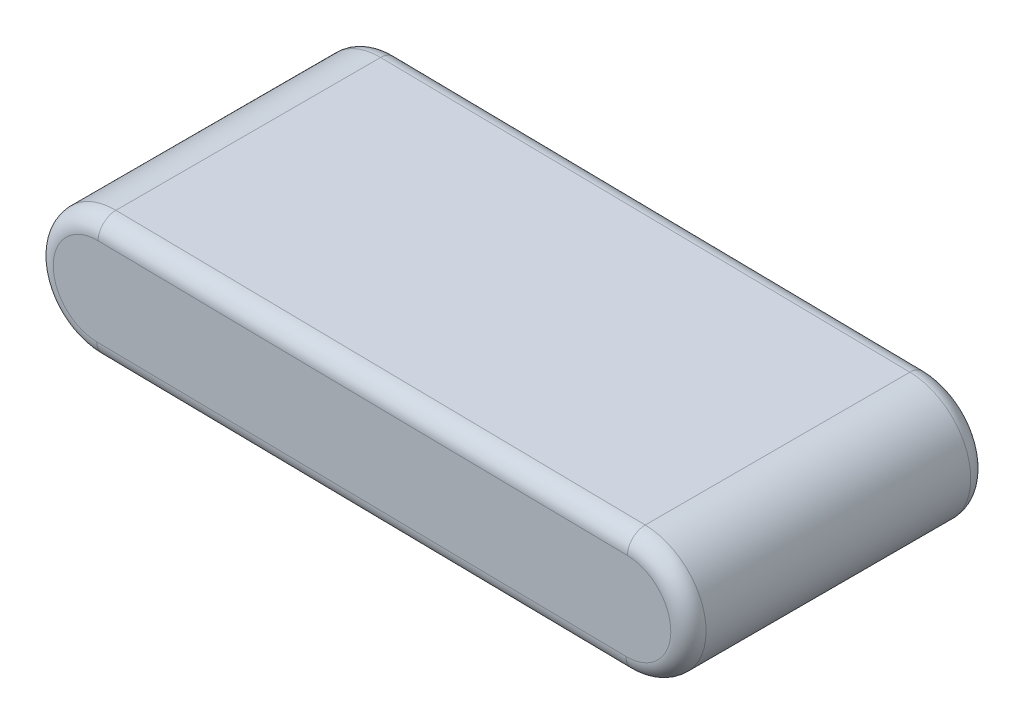
ISO-10303-21;
HEADER;
FILE_DESCRIPTION(('STEP AP214'),'2;1');
FILE_NAME('part.step','',(''),(''),'','','');
FILE_SCHEMA(('AUTOMOTIVE_DESIGN { 1 0 10303 214 1 1 1 1 }'));
ENDSEC;
DATA;
#1=APPLICATION_CONTEXT('core data for automotive mechanical design processes');
#2=APPLICATION_PROTOCOL_DEFINITION('international standard','automotive_design',2000,#1);
#3=PRODUCT_CONTEXT('',#1,'mechanical');
#4=PRODUCT('Part','Part','',(#3));
#5=PRODUCT_RELATED_PRODUCT_CATEGORY('part','',(#4));
#6=PRODUCT_DEFINITION_FORMATION('','',#4);
#7=PRODUCT_DEFINITION_CONTEXT('part definition',#1,'design');
#8=PRODUCT_DEFINITION('design','',#6,#7);
#9=PRODUCT_DEFINITION_SHAPE('','',#8);
#10=(LENGTH_UNIT() NAMED_UNIT(*) SI_UNIT(.MILLI.,.METRE.));
#11=(NAMED_UNIT(*) PLANE_ANGLE_UNIT() SI_UNIT($,.RADIAN.));
#12=(NAMED_UNIT(*) SI_UNIT($,.STERADIAN.) SOLID_ANGLE_UNIT());
#13=UNCERTAINTY_MEASURE_WITH_UNIT(LENGTH_MEASURE(1.E-05),#10,'distance_accuracy_value','');
#14=(GEOMETRIC_REPRESENTATION_CONTEXT(3) GLOBAL_UNCERTAINTY_ASSIGNED_CONTEXT((#13)) GLOBAL_UNIT_ASSIGNED_CONTEXT((#10,
#11,#12)) REPRESENTATION_CONTEXT('',''));
#15=CARTESIAN_POINT('',(0.,0.,0.));
#16=DIRECTION('',(0.,0.,1.));
#17=DIRECTION('',(1.,0.,0.));
#18=AXIS2_PLACEMENT_3D('',#15,#16,#17);
#19=CARTESIAN_POINT('',(-15.,0.223432304225751,17.));
#20=DIRECTION('',(0.,0.,-1.));
#21=DIRECTION('',(-1.,0.,0.));
#22=AXIS2_PLACEMENT_3D('',#19,#20,#21);
#23=CYLINDRICAL_SURFACE('',#22,3.5);
#24=DIRECTION('',(0.,0.,-1.));
#25=VECTOR('',#24,1.);
#26=CARTESIAN_POINT('',(-14.9478715783705,3.72304408664654,17.));
#27=LINE('',#26,#25);
#28=CARTESIAN_POINT('',(-14.9478715783705,3.72304408664654,16.));
#29=VERTEX_POINT('',#28);
#30=CARTESIAN_POINT('',(-14.9478715783705,3.72304408664654,1.));
#31=VERTEX_POINT('',#30);
#32=EDGE_CURVE('E104',#29,#31,#27,.T.);
#33=ORIENTED_EDGE('',*,*,#32,.T.);
#34=CARTESIAN_POINT('',(-15.,0.223432304225751,1.));
#35=DIRECTION('',(0.,0.,1.));
#36=DIRECTION('',(1.,0.,0.));
#37=AXIS2_PLACEMENT_3D('',#34,#35,#36);
#38=CIRCLE('',#37,3.5);
#39=CARTESIAN_POINT('',(-15.0521284216295,-3.27617947819504,1.));
#40=VERTEX_POINT('',#39);
#41=EDGE_CURVE('E183',#31,#40,#38,.T.);
#42=ORIENTED_EDGE('',*,*,#41,.T.);
#43=DIRECTION('',(0.,0.,-1.));
#44=VECTOR('',#43,1.);
#45=CARTESIAN_POINT('',(-15.0521284216295,-3.27617947819504,17.));
#46=LINE('',#45,#44);
#47=CARTESIAN_POINT('',(-15.0521284216295,-3.27617947819504,16.));
#48=VERTEX_POINT('',#47);
#49=EDGE_CURVE('E130',#48,#40,#46,.T.);
#50=ORIENTED_EDGE('',*,*,#49,.F.);
#51=CARTESIAN_POINT('',(-15.,0.223432304225751,16.));
#52=DIRECTION('',(0.,0.,1.));
#53=DIRECTION('',(1.,0.,0.));
#54=AXIS2_PLACEMENT_3D('',#51,#52,#53);
#55=CIRCLE('',#54,3.5);
#56=EDGE_CURVE('E181',#48,#29,#55,.F.);
#57=ORIENTED_EDGE('',*,*,#56,.T.);
#58=EDGE_LOOP('',(#33,#42,#50,#57));
#59=FACE_BOUND('',#58,.T.);
#60=ADVANCED_FACE('F33',(#59),#23,.T.);
#61=CARTESIAN_POINT('',(-15.0521284216295,-3.27617947819504,17.));
#62=DIRECTION('',(0.0148938347512736,0.999889080691654,0.));
#63=DIRECTION('',(-0.999889080691654,0.0148938347512736,0.));
#64=AXIS2_PLACEMENT_3D('',#61,#62,#63);
#65=PLANE('',#64);
#66=ORIENTED_EDGE('',*,*,#49,.T.);
#67=DIRECTION('',(0.999889080691654,-0.0148938347512736,0.));
#68=VECTOR('',#67,1.);
#69=CARTESIAN_POINT('',(-15.0521284216295,-3.27617947819504,1.));
#70=LINE('',#69,#68);
#71=CARTESIAN_POINT('',(14.9478715783705,-3.72304408664654,1.));
#72=VERTEX_POINT('',#71);
#73=EDGE_CURVE('E179',#40,#72,#70,.T.);
#74=ORIENTED_EDGE('',*,*,#73,.T.);
#75=DIRECTION('',(0.,0.,-1.));
#76=VECTOR('',#75,1.);
#77=CARTESIAN_POINT('',(14.9478715783705,-3.72304408664654,17.));
#78=LINE('',#77,#76);
#79=CARTESIAN_POINT('',(14.9478715783705,-3.72304408664654,16.));
#80=VERTEX_POINT('',#79);
#81=EDGE_CURVE('E121',#80,#72,#78,.T.);
#82=ORIENTED_EDGE('',*,*,#81,.F.);
#83=DIRECTION('',(0.999889080691654,-0.0148938347512736,0.));
#84=VECTOR('',#83,1.);
#85=CARTESIAN_POINT('',(-15.0521284216295,-3.27617947819504,16.));
#86=LINE('',#85,#84);
#87=EDGE_CURVE('E177',#80,#48,#86,.F.);
#88=ORIENTED_EDGE('',*,*,#87,.T.);
#89=EDGE_LOOP('',(#66,#74,#82,#88));
#90=FACE_BOUND('',#89,.T.);
#91=ADVANCED_FACE('F194',(#90),#65,.F.);
#92=CARTESIAN_POINT('',(15.,-0.223432304225751,17.));
#93=DIRECTION('',(0.,0.,-1.));
#94=DIRECTION('',(-1.,0.,0.));
#95=AXIS2_PLACEMENT_3D('',#92,#93,#94);
#96=CYLINDRICAL_SURFACE('',#95,3.5);
#97=ORIENTED_EDGE('',*,*,#81,.T.);
#98=CARTESIAN_POINT('',(15.,-0.223432304225751,1.));
#99=DIRECTION('',(0.,0.,1.));
#100=DIRECTION('',(1.,0.,0.));
#101=AXIS2_PLACEMENT_3D('',#98,#99,#100);
#102=CIRCLE('',#101,3.5);
#103=CARTESIAN_POINT('',(15.0521284216295,3.27617947819504,1.));
#104=VERTEX_POINT('',#103);
#105=EDGE_CURVE('E120',#72,#104,#102,.T.);
#106=ORIENTED_EDGE('',*,*,#105,.T.);
#107=DIRECTION('',(0.,0.,-1.));
#108=VECTOR('',#107,1.);
#109=CARTESIAN_POINT('',(15.0521284216295,3.27617947819504,17.));
#110=LINE('',#109,#108);
#111=CARTESIAN_POINT('',(15.0521284216295,3.27617947819504,16.));
#112=VERTEX_POINT('',#111);
#113=EDGE_CURVE('E102',#112,#104,#110,.T.);
#114=ORIENTED_EDGE('',*,*,#113,.F.);
#115=CARTESIAN_POINT('',(15.,-0.223432304225751,16.));
#116=DIRECTION('',(0.,0.,1.));
#117=DIRECTION('',(1.,0.,0.));
#118=AXIS2_PLACEMENT_3D('',#115,#116,#117);
#119=CIRCLE('',#118,3.5);
#120=EDGE_CURVE('E117',#112,#80,#119,.F.);
#121=ORIENTED_EDGE('',*,*,#120,.T.);
#122=EDGE_LOOP('',(#97,#106,#114,#121));
#123=FACE_BOUND('',#122,.T.);
#124=ADVANCED_FACE('F116',(#123),#96,.T.);
#125=CARTESIAN_POINT('',(-14.9478715783705,3.72304408664654,17.));
#126=DIRECTION('',(-0.0148938347512736,-0.999889080691654,0.));
#127=DIRECTION('',(0.999889080691654,-0.0148938347512736,0.));
#128=AXIS2_PLACEMENT_3D('',#125,#126,#127);
#129=PLANE('',#128);
#130=ORIENTED_EDGE('',*,*,#113,.T.);
#131=DIRECTION('',(-0.999889080691654,0.0148938347512736,0.));
#132=VECTOR('',#131,1.);
#133=CARTESIAN_POINT('',(-14.9478715783705,3.72304408664654,1.));
#134=LINE('',#133,#132);
#135=EDGE_CURVE('E11',#104,#31,#134,.T.);
#136=ORIENTED_EDGE('',*,*,#135,.T.);
#137=ORIENTED_EDGE('',*,*,#32,.F.);
#138=DIRECTION('',(-0.999889080691654,0.0148938347512736,0.));
#139=VECTOR('',#138,1.);
#140=CARTESIAN_POINT('',(15.0521284216295,3.27617947819504,16.));
#141=LINE('',#140,#139);
#142=EDGE_CURVE('E42',#29,#112,#141,.F.);
#143=ORIENTED_EDGE('',*,*,#142,.T.);
#144=EDGE_LOOP('',(#130,#136,#137,#143));
#145=FACE_BOUND('',#144,.T.);
#146=ADVANCED_FACE('F101',(#145),#129,.F.);
#147=CARTESIAN_POINT('',(-15.,0.223432304225751,17.));
#148=DIRECTION('',(0.,0.,1.));
#149=DIRECTION('',(1.,0.,0.));
#150=AXIS2_PLACEMENT_3D('',#147,#148,#149);
#151=PLANE('',#150);
#152=DIRECTION('',(0.999889080691654,-0.0148938347512736,0.));
#153=VECTOR('',#152,1.);
#154=CARTESIAN_POINT('',(14.9627654131218,-2.72315500595489,17.));
#155=LINE('',#154,#153);
#156=CARTESIAN_POINT('',(-15.0372345868782,-2.27629039750339,17.));
#157=VERTEX_POINT('',#156);
#158=CARTESIAN_POINT('',(14.9627654131218,-2.72315500595489,17.));
#159=VERTEX_POINT('',#158);
#160=EDGE_CURVE('E50',#157,#159,#155,.T.);
#161=ORIENTED_EDGE('',*,*,#160,.T.);
#162=CARTESIAN_POINT('',(15.,-0.223432304225751,17.));
#163=DIRECTION('',(0.,0.,1.));
#164=DIRECTION('',(1.,0.,0.));
#165=AXIS2_PLACEMENT_3D('',#162,#163,#164);
#166=CIRCLE('',#165,2.5);
#167=CARTESIAN_POINT('',(15.0372345868782,2.27629039750339,17.));
#168=VERTEX_POINT('',#167);
#169=EDGE_CURVE('E109',#159,#168,#166,.T.);
#170=ORIENTED_EDGE('',*,*,#169,.T.);
#171=DIRECTION('',(-0.999889080691654,0.0148938347512736,0.));
#172=VECTOR('',#171,1.);
#173=CARTESIAN_POINT('',(-14.9627654131218,2.72315500595489,17.));
#174=LINE('',#173,#172);
#175=CARTESIAN_POINT('',(-14.9627654131218,2.72315500595489,17.));
#176=VERTEX_POINT('',#175);
#177=EDGE_CURVE('E133',#168,#176,#174,.T.);
#178=ORIENTED_EDGE('',*,*,#177,.T.);
#179=CARTESIAN_POINT('',(-15.,0.223432304225751,17.));
#180=DIRECTION('',(0.,0.,1.));
#181=DIRECTION('',(1.,0.,0.));
#182=AXIS2_PLACEMENT_3D('',#179,#180,#181);
#183=CIRCLE('',#182,2.5);
#184=EDGE_CURVE('E55',#176,#157,#183,.T.);
#185=ORIENTED_EDGE('',*,*,#184,.T.);
#186=EDGE_LOOP('',(#161,#170,#178,#185));
#187=FACE_BOUND('',#186,.T.);
#188=ADVANCED_FACE('F188',(#187),#151,.T.);
#189=CARTESIAN_POINT('',(-15.,0.223432304225751,0.));
#190=DIRECTION('',(0.,0.,1.));
#191=DIRECTION('',(1.,0.,0.));
#192=AXIS2_PLACEMENT_3D('',#189,#190,#191);
#193=PLANE('',#192);
#194=DIRECTION('',(-0.999889080691654,0.0148938347512736,0.));
#195=VECTOR('',#194,1.);
#196=CARTESIAN_POINT('',(-14.9627654131218,2.72315500595489,0.));
#197=LINE('',#196,#195);
#198=CARTESIAN_POINT('',(-14.9627654131218,2.72315500595489,0.));
#199=VERTEX_POINT('',#198);
#200=CARTESIAN_POINT('',(15.0372345868782,2.27629039750339,0.));
#201=VERTEX_POINT('',#200);
#202=EDGE_CURVE('E168',#199,#201,#197,.F.);
#203=ORIENTED_EDGE('',*,*,#202,.T.);
#204=CARTESIAN_POINT('',(15.,-0.223432304225751,0.));
#205=DIRECTION('',(0.,0.,1.));
#206=DIRECTION('',(1.,0.,0.));
#207=AXIS2_PLACEMENT_3D('',#204,#205,#206);
#208=CIRCLE('',#207,2.5);
#209=CARTESIAN_POINT('',(14.9627654131218,-2.72315500595489,0.));
#210=VERTEX_POINT('',#209);
#211=EDGE_CURVE('E174',#201,#210,#208,.F.);
#212=ORIENTED_EDGE('',*,*,#211,.T.);
#213=DIRECTION('',(0.999889080691654,-0.0148938347512736,0.));
#214=VECTOR('',#213,1.);
#215=CARTESIAN_POINT('',(-15.0372345868782,-2.27629039750339,0.));
#216=LINE('',#215,#214);
#217=CARTESIAN_POINT('',(-15.0372345868782,-2.27629039750339,0.));
#218=VERTEX_POINT('',#217);
#219=EDGE_CURVE('E172',#210,#218,#216,.F.);
#220=ORIENTED_EDGE('',*,*,#219,.T.);
#221=CARTESIAN_POINT('',(-15.,0.223432304225751,0.));
#222=DIRECTION('',(0.,0.,1.));
#223=DIRECTION('',(1.,0.,0.));
#224=AXIS2_PLACEMENT_3D('',#221,#222,#223);
#225=CIRCLE('',#224,2.5);
#226=EDGE_CURVE('E170',#218,#199,#225,.F.);
#227=ORIENTED_EDGE('',*,*,#226,.T.);
#228=EDGE_LOOP('',(#203,#212,#220,#227));
#229=FACE_BOUND('',#228,.T.);
#230=ADVANCED_FACE('F220',(#229),#193,.F.);
#231=CARTESIAN_POINT('',(-15.,0.223432304225751,1.));
#232=DIRECTION('',(0.,0.,1.));
#233=DIRECTION('',(1.,0.,0.));
#234=AXIS2_PLACEMENT_3D('',#231,#232,#233);
#235=TOROIDAL_SURFACE('',#234,2.5,1.);
#236=CARTESIAN_POINT('',(-14.9627654131218,2.72315500595489,1.));
#237=DIRECTION('',(0.999889080691654,-0.0148938347512752,0.));
#238=DIRECTION('',(0.0148938347512752,0.999889080691654,0.));
#239=AXIS2_PLACEMENT_3D('',#236,#237,#238);
#240=CIRCLE('',#239,1.);
#241=EDGE_CURVE('E149',#199,#31,#240,.T.);
#242=ORIENTED_EDGE('',*,*,#241,.F.);
#243=ORIENTED_EDGE('',*,*,#226,.F.);
#244=CARTESIAN_POINT('',(-15.0372345868782,-2.27629039750339,1.));
#245=DIRECTION('',(0.999889080691654,-0.0148938347512683,0.));
#246=DIRECTION('',(0.0148938347512683,0.999889080691654,0.));
#247=AXIS2_PLACEMENT_3D('',#244,#245,#246);
#248=CIRCLE('',#247,1.);
#249=EDGE_CURVE('E138',#40,#218,#248,.T.);
#250=ORIENTED_EDGE('',*,*,#249,.F.);
#251=ORIENTED_EDGE('',*,*,#41,.F.);
#252=EDGE_LOOP('',(#242,#243,#250,#251));
#253=FACE_BOUND('',#252,.T.);
#254=ADVANCED_FACE('F196',(#253),#235,.T.);
#255=CARTESIAN_POINT('',(-15.0372345868782,-2.27629039750339,1.));
#256=DIRECTION('',(0.999889080691654,-0.0148938347512736,0.));
#257=DIRECTION('',(0.0148938347512736,0.999889080691654,0.));
#258=AXIS2_PLACEMENT_3D('',#255,#256,#257);
#259=CYLINDRICAL_SURFACE('',#258,1.);
#260=ORIENTED_EDGE('',*,*,#249,.T.);
#261=ORIENTED_EDGE('',*,*,#219,.F.);
#262=CARTESIAN_POINT('',(14.9627654131218,-2.72315500595489,1.));
#263=DIRECTION('',(0.999889080691654,-0.0148938347512735,0.));
#264=DIRECTION('',(0.0148938347512735,0.999889080691654,0.));
#265=AXIS2_PLACEMENT_3D('',#262,#263,#264);
#266=CIRCLE('',#265,1.);
#267=EDGE_CURVE('E143',#72,#210,#266,.T.);
#268=ORIENTED_EDGE('',*,*,#267,.F.);
#269=ORIENTED_EDGE('',*,*,#73,.F.);
#270=EDGE_LOOP('',(#260,#261,#268,#269));
#271=FACE_BOUND('',#270,.T.);
#272=ADVANCED_FACE('F199',(#271),#259,.T.);
#273=CARTESIAN_POINT('',(-14.9627654131218,2.72315500595489,1.));
#274=DIRECTION('',(-0.999889080691654,0.0148938347512736,0.));
#275=DIRECTION('',(-0.0148938347512736,-0.999889080691654,0.));
#276=AXIS2_PLACEMENT_3D('',#273,#274,#275);
#277=CYLINDRICAL_SURFACE('',#276,1.);
#278=ORIENTED_EDGE('',*,*,#241,.T.);
#279=ORIENTED_EDGE('',*,*,#135,.F.);
#280=CARTESIAN_POINT('',(15.0372345868782,2.27629039750339,1.));
#281=DIRECTION('',(0.999889080691654,-0.0148938347512752,0.));
#282=DIRECTION('',(0.0148938347512752,0.999889080691654,0.));
#283=AXIS2_PLACEMENT_3D('',#280,#281,#282);
#284=CIRCLE('',#283,1.);
#285=EDGE_CURVE('E141',#201,#104,#284,.T.);
#286=ORIENTED_EDGE('',*,*,#285,.F.);
#287=ORIENTED_EDGE('',*,*,#202,.F.);
#288=EDGE_LOOP('',(#278,#279,#286,#287));
#289=FACE_BOUND('',#288,.T.);
#290=ADVANCED_FACE('F202',(#289),#277,.T.);
#291=CARTESIAN_POINT('',(15.,-0.223432304225751,1.));
#292=DIRECTION('',(0.,0.,1.));
#293=DIRECTION('',(1.,0.,0.));
#294=AXIS2_PLACEMENT_3D('',#291,#292,#293);
#295=TOROIDAL_SURFACE('',#294,2.5,1.);
#296=ORIENTED_EDGE('',*,*,#267,.T.);
#297=ORIENTED_EDGE('',*,*,#211,.F.);
#298=ORIENTED_EDGE('',*,*,#285,.T.);
#299=ORIENTED_EDGE('',*,*,#105,.F.);
#300=EDGE_LOOP('',(#296,#297,#298,#299));
#301=FACE_BOUND('',#300,.T.);
#302=ADVANCED_FACE('F200',(#301),#295,.T.);
#303=CARTESIAN_POINT('',(-15.,0.223432304225751,16.));
#304=DIRECTION('',(0.,0.,1.));
#305=DIRECTION('',(1.,0.,0.));
#306=AXIS2_PLACEMENT_3D('',#303,#304,#305);
#307=TOROIDAL_SURFACE('',#306,2.5,1.);
#308=CARTESIAN_POINT('',(-14.9627654131218,2.72315500595489,16.));
#309=DIRECTION('',(0.999889080691654,-0.0148938347512752,0.));
#310=DIRECTION('',(0.0148938347512752,0.999889080691654,0.));
#311=AXIS2_PLACEMENT_3D('',#308,#309,#310);
#312=CIRCLE('',#311,1.);
#313=EDGE_CURVE('E135',#29,#176,#312,.T.);
#314=ORIENTED_EDGE('',*,*,#313,.F.);
#315=ORIENTED_EDGE('',*,*,#56,.F.);
#316=CARTESIAN_POINT('',(-15.0372345868782,-2.27629039750339,16.));
#317=DIRECTION('',(0.999889080691654,-0.0148938347512735,0.));
#318=DIRECTION('',(0.0148938347512735,0.999889080691654,0.));
#319=AXIS2_PLACEMENT_3D('',#316,#317,#318);
#320=CIRCLE('',#319,1.);
#321=EDGE_CURVE('E37',#157,#48,#320,.T.);
#322=ORIENTED_EDGE('',*,*,#321,.F.);
#323=ORIENTED_EDGE('',*,*,#184,.F.);
#324=EDGE_LOOP('',(#314,#315,#322,#323));
#325=FACE_BOUND('',#324,.T.);
#326=ADVANCED_FACE('F35',(#325),#307,.T.);
#327=CARTESIAN_POINT('',(-15.0372345868782,-2.27629039750339,16.));
#328=DIRECTION('',(-0.999889080691654,0.0148938347512736,0.));
#329=DIRECTION('',(-0.0148938347512736,-0.999889080691654,0.));
#330=AXIS2_PLACEMENT_3D('',#327,#328,#329);
#331=CYLINDRICAL_SURFACE('',#330,1.);
#332=ORIENTED_EDGE('',*,*,#321,.T.);
#333=ORIENTED_EDGE('',*,*,#87,.F.);
#334=CARTESIAN_POINT('',(14.9627654131218,-2.72315500595489,16.));
#335=DIRECTION('',(0.999889080691654,-0.0148938347512683,0.));
#336=DIRECTION('',(0.0148938347512683,0.999889080691654,0.));
#337=AXIS2_PLACEMENT_3D('',#334,#335,#336);
#338=CIRCLE('',#337,1.);
#339=EDGE_CURVE('E128',#159,#80,#338,.T.);
#340=ORIENTED_EDGE('',*,*,#339,.F.);
#341=ORIENTED_EDGE('',*,*,#160,.F.);
#342=EDGE_LOOP('',(#332,#333,#340,#341));
#343=FACE_BOUND('',#342,.T.);
#344=ADVANCED_FACE('F191',(#343),#331,.T.);
#345=CARTESIAN_POINT('',(-14.9627654131218,2.72315500595489,16.));
#346=DIRECTION('',(0.999889080691654,-0.0148938347512736,0.));
#347=DIRECTION('',(0.0148938347512736,0.999889080691654,0.));
#348=AXIS2_PLACEMENT_3D('',#345,#346,#347);
#349=CYLINDRICAL_SURFACE('',#348,1.);
#350=ORIENTED_EDGE('',*,*,#313,.T.);
#351=ORIENTED_EDGE('',*,*,#177,.F.);
#352=CARTESIAN_POINT('',(15.0372345868782,2.27629039750339,16.));
#353=DIRECTION('',(0.999889080691654,-0.0148938347512735,0.));
#354=DIRECTION('',(0.0148938347512735,0.999889080691654,0.));
#355=AXIS2_PLACEMENT_3D('',#352,#353,#354);
#356=CIRCLE('',#355,1.);
#357=EDGE_CURVE('E126',#112,#168,#356,.T.);
#358=ORIENTED_EDGE('',*,*,#357,.F.);
#359=ORIENTED_EDGE('',*,*,#142,.F.);
#360=EDGE_LOOP('',(#350,#351,#358,#359));
#361=FACE_BOUND('',#360,.T.);
#362=ADVANCED_FACE('F132',(#361),#349,.T.);
#363=CARTESIAN_POINT('',(15.,-0.223432304225751,16.));
#364=DIRECTION('',(0.,0.,1.));
#365=DIRECTION('',(1.,0.,0.));
#366=AXIS2_PLACEMENT_3D('',#363,#364,#365);
#367=TOROIDAL_SURFACE('',#366,2.5,1.);
#368=ORIENTED_EDGE('',*,*,#339,.T.);
#369=ORIENTED_EDGE('',*,*,#120,.F.);
#370=ORIENTED_EDGE('',*,*,#357,.T.);
#371=ORIENTED_EDGE('',*,*,#169,.F.);
#372=EDGE_LOOP('',(#368,#369,#370,#371));
#373=FACE_BOUND('',#372,.T.);
#374=ADVANCED_FACE('F124',(#373),#367,.T.);
#375=CLOSED_SHELL('',(#60,#91,#124,#146,#188,#230,#254,#272,#290,#302,#326,#344,#362,#374));
#376=MANIFOLD_SOLID_BREP('B2',#375);
#377=ADVANCED_BREP_SHAPE_REPRESENTATION('',(#18,#376),#14);
#378=SHAPE_DEFINITION_REPRESENTATION(#9,#377);
ENDSEC;
END-ISO-10303-21;
